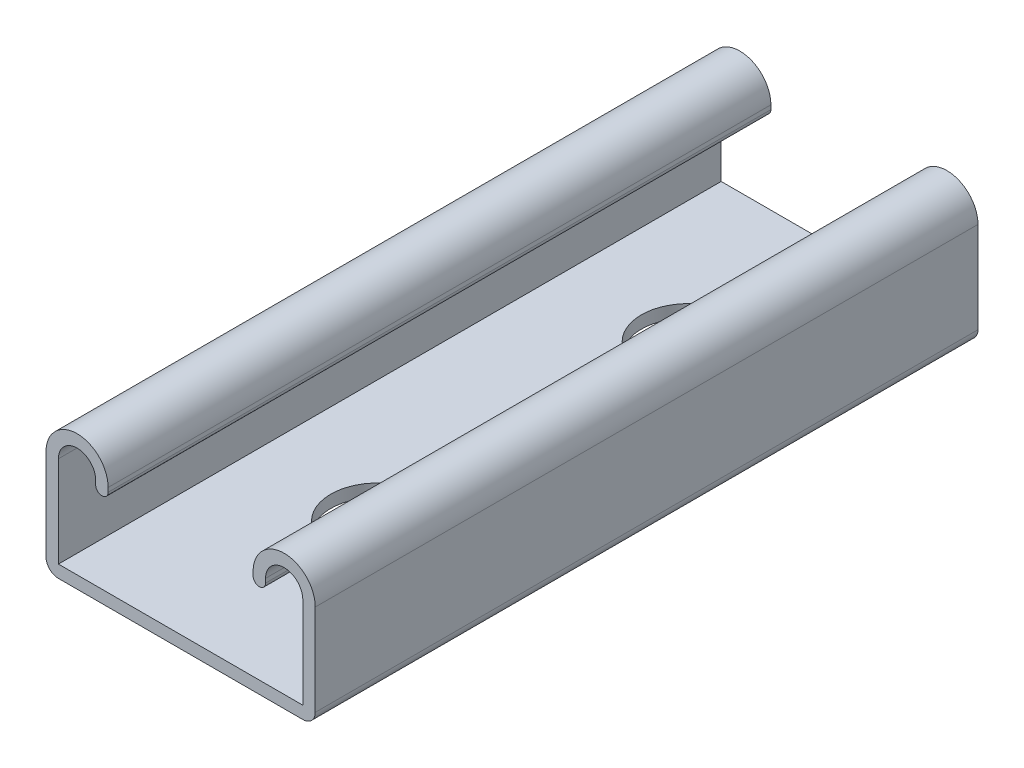
ISO-10303-21;
HEADER;
FILE_DESCRIPTION(('STEP AP214'),'2;1');
FILE_NAME('part.step','',(''),(''),'','','');
FILE_SCHEMA(('AUTOMOTIVE_DESIGN { 1 0 10303 214 1 1 1 1 }'));
ENDSEC;
DATA;
#1=APPLICATION_CONTEXT('core data for automotive mechanical design processes');
#2=APPLICATION_PROTOCOL_DEFINITION('international standard','automotive_design',2000,#1);
#3=PRODUCT_CONTEXT('',#1,'mechanical');
#4=PRODUCT('Part','Part','',(#3));
#5=PRODUCT_RELATED_PRODUCT_CATEGORY('part','',(#4));
#6=PRODUCT_DEFINITION_FORMATION('','',#4);
#7=PRODUCT_DEFINITION_CONTEXT('part definition',#1,'design');
#8=PRODUCT_DEFINITION('design','',#6,#7);
#9=PRODUCT_DEFINITION_SHAPE('','',#8);
#10=(LENGTH_UNIT() NAMED_UNIT(*) SI_UNIT(.MILLI.,.METRE.));
#11=(NAMED_UNIT(*) PLANE_ANGLE_UNIT() SI_UNIT($,.RADIAN.));
#12=(NAMED_UNIT(*) SI_UNIT($,.STERADIAN.) SOLID_ANGLE_UNIT());
#13=UNCERTAINTY_MEASURE_WITH_UNIT(LENGTH_MEASURE(1.E-05),#10,'distance_accuracy_value','');
#14=(GEOMETRIC_REPRESENTATION_CONTEXT(3) GLOBAL_UNCERTAINTY_ASSIGNED_CONTEXT((#13)) GLOBAL_UNIT_ASSIGNED_CONTEXT((#10,
#11,#12)) REPRESENTATION_CONTEXT('',''));
#15=CARTESIAN_POINT('',(0.,0.,0.));
#16=DIRECTION('',(0.,0.,1.));
#17=DIRECTION('',(1.,0.,0.));
#18=AXIS2_PLACEMENT_3D('',#15,#16,#17);
#19=CARTESIAN_POINT('',(-15.875,7.4295,101.6));
#20=DIRECTION('',(0.,0.,-1.));
#21=DIRECTION('',(-1.,0.,0.));
#22=AXIS2_PLACEMENT_3D('',#19,#20,#21);
#23=CYLINDRICAL_SURFACE('',#22,4.7625);
#24=CARTESIAN_POINT('',(-15.875,7.4295,0.));
#25=DIRECTION('',(0.,0.,1.));
#26=DIRECTION('',(-1.,0.,0.));
#27=AXIS2_PLACEMENT_3D('',#24,#25,#26);
#28=CIRCLE('',#27,4.7625);
#29=CARTESIAN_POINT('',(-11.1125,7.4295,0.));
#30=VERTEX_POINT('',#29);
#31=CARTESIAN_POINT('',(-20.6375,7.4295,0.));
#32=VERTEX_POINT('',#31);
#33=EDGE_CURVE('E189',#30,#32,#28,.T.);
#34=ORIENTED_EDGE('',*,*,#33,.T.);
#35=DIRECTION('',(0.,0.,-1.));
#36=VECTOR('',#35,1.);
#37=CARTESIAN_POINT('',(-20.6375,7.4295,101.6));
#38=LINE('',#37,#36);
#39=CARTESIAN_POINT('',(-20.6375,7.4295,101.6));
#40=VERTEX_POINT('',#39);
#41=EDGE_CURVE('E11',#40,#32,#38,.T.);
#42=ORIENTED_EDGE('',*,*,#41,.F.);
#43=CARTESIAN_POINT('',(-15.875,7.4295,101.6));
#44=DIRECTION('',(0.,0.,1.));
#45=DIRECTION('',(-1.,0.,0.));
#46=AXIS2_PLACEMENT_3D('',#43,#44,#45);
#47=CIRCLE('',#46,4.7625);
#48=CARTESIAN_POINT('',(-11.1125,7.4295,101.6));
#49=VERTEX_POINT('',#48);
#50=EDGE_CURVE('E223',#49,#40,#47,.T.);
#51=ORIENTED_EDGE('',*,*,#50,.F.);
#52=DIRECTION('',(0.,0.,-1.));
#53=VECTOR('',#52,1.);
#54=CARTESIAN_POINT('',(-11.1125,7.4295,101.6));
#55=LINE('',#54,#53);
#56=EDGE_CURVE('E185',#49,#30,#55,.T.);
#57=ORIENTED_EDGE('',*,*,#56,.T.);
#58=EDGE_LOOP('',(#34,#42,#51,#57));
#59=FACE_BOUND('',#58,.T.);
#60=ADVANCED_FACE('F32',(#59),#23,.T.);
#61=CARTESIAN_POINT('',(-20.6375,7.4295,101.6));
#62=DIRECTION('',(1.,0.,0.));
#63=DIRECTION('',(0.,0.,-1.));
#64=AXIS2_PLACEMENT_3D('',#61,#62,#63);
#65=PLANE('',#64);
#66=DIRECTION('',(0.,-1.,0.));
#67=VECTOR('',#66,1.);
#68=CARTESIAN_POINT('',(-20.6375,7.4295,0.));
#69=LINE('',#68,#67);
#70=CARTESIAN_POINT('',(-20.6375,-6.5532,0.));
#71=VERTEX_POINT('',#70);
#72=EDGE_CURVE('E192',#32,#71,#69,.T.);
#73=ORIENTED_EDGE('',*,*,#72,.T.);
#74=DIRECTION('',(0.,0.,-1.));
#75=VECTOR('',#74,1.);
#76=CARTESIAN_POINT('',(-20.6375,-6.5532,101.6));
#77=LINE('',#76,#75);
#78=CARTESIAN_POINT('',(-20.6375,-6.5532,101.6));
#79=VERTEX_POINT('',#78);
#80=EDGE_CURVE('E41',#79,#71,#77,.T.);
#81=ORIENTED_EDGE('',*,*,#80,.F.);
#82=DIRECTION('',(0.,-1.,0.));
#83=VECTOR('',#82,1.);
#84=CARTESIAN_POINT('',(-20.6375,7.4295,101.6));
#85=LINE('',#84,#83);
#86=EDGE_CURVE('E122',#40,#79,#85,.T.);
#87=ORIENTED_EDGE('',*,*,#86,.F.);
#88=ORIENTED_EDGE('',*,*,#41,.T.);
#89=EDGE_LOOP('',(#73,#81,#87,#88));
#90=FACE_BOUND('',#89,.T.);
#91=ADVANCED_FACE('F332',(#90),#65,.F.);
#92=CARTESIAN_POINT('',(-18.7325,-6.5532,101.6));
#93=DIRECTION('',(0.,0.,-1.));
#94=DIRECTION('',(-1.,0.,0.));
#95=AXIS2_PLACEMENT_3D('',#92,#93,#94);
#96=CYLINDRICAL_SURFACE('',#95,1.905);
#97=CARTESIAN_POINT('',(-18.7325,-6.5532,0.));
#98=DIRECTION('',(0.,0.,1.));
#99=DIRECTION('',(-1.,0.,0.));
#100=AXIS2_PLACEMENT_3D('',#97,#98,#99);
#101=CIRCLE('',#100,1.905);
#102=CARTESIAN_POINT('',(-18.7325,-8.4582,0.));
#103=VERTEX_POINT('',#102);
#104=EDGE_CURVE('E194',#71,#103,#101,.T.);
#105=ORIENTED_EDGE('',*,*,#104,.T.);
#106=DIRECTION('',(0.,0.,-1.));
#107=VECTOR('',#106,1.);
#108=CARTESIAN_POINT('',(-18.7325,-8.4582,101.6));
#109=LINE('',#108,#107);
#110=CARTESIAN_POINT('',(-18.7325,-8.4582,101.6));
#111=VERTEX_POINT('',#110);
#112=EDGE_CURVE('E260',#111,#103,#109,.T.);
#113=ORIENTED_EDGE('',*,*,#112,.F.);
#114=CARTESIAN_POINT('',(-18.7325,-6.5532,101.6));
#115=DIRECTION('',(0.,0.,1.));
#116=DIRECTION('',(-1.,0.,0.));
#117=AXIS2_PLACEMENT_3D('',#114,#115,#116);
#118=CIRCLE('',#117,1.905);
#119=EDGE_CURVE('E269',#79,#111,#118,.T.);
#120=ORIENTED_EDGE('',*,*,#119,.F.);
#121=ORIENTED_EDGE('',*,*,#80,.T.);
#122=EDGE_LOOP('',(#105,#113,#120,#121));
#123=FACE_BOUND('',#122,.T.);
#124=ADVANCED_FACE('F267',(#123),#96,.T.);
#125=CARTESIAN_POINT('',(-18.7325,-8.4582,101.6));
#126=DIRECTION('',(0.,1.,0.));
#127=DIRECTION('',(0.,0.,1.));
#128=AXIS2_PLACEMENT_3D('',#125,#126,#127);
#129=PLANE('',#128);
#130=CARTESIAN_POINT('',(0.,-8.4582,71.4375));
#131=DIRECTION('',(0.,-1.,0.));
#132=DIRECTION('',(0.,0.,-1.));
#133=AXIS2_PLACEMENT_3D('',#130,#131,#132);
#134=CIRCLE('',#133,7.14375);
#135=CARTESIAN_POINT('',(0.,-8.4582,64.29375));
#136=VERTEX_POINT('',#135);
#137=EDGE_CURVE('E451',#136,#136,#134,.T.);
#138=ORIENTED_EDGE('',*,*,#137,.F.);
#139=EDGE_LOOP('',(#138));
#140=FACE_BOUND('',#139,.T.);
#141=CARTESIAN_POINT('',(0.,-8.4582,23.8125));
#142=DIRECTION('',(0.,-1.,0.));
#143=DIRECTION('',(0.,0.,-1.));
#144=AXIS2_PLACEMENT_3D('',#141,#142,#143);
#145=CIRCLE('',#144,7.14375);
#146=CARTESIAN_POINT('',(0.,-8.4582,16.66875));
#147=VERTEX_POINT('',#146);
#148=EDGE_CURVE('E455',#147,#147,#145,.T.);
#149=ORIENTED_EDGE('',*,*,#148,.F.);
#150=EDGE_LOOP('',(#149));
#151=FACE_BOUND('',#150,.T.);
#152=DIRECTION('',(1.,0.,0.));
#153=VECTOR('',#152,1.);
#154=CARTESIAN_POINT('',(-18.7325,-8.4582,0.));
#155=LINE('',#154,#153);
#156=CARTESIAN_POINT('',(18.7325,-8.4582,0.));
#157=VERTEX_POINT('',#156);
#158=EDGE_CURVE('E196',#103,#157,#155,.T.);
#159=ORIENTED_EDGE('',*,*,#158,.T.);
#160=DIRECTION('',(0.,0.,-1.));
#161=VECTOR('',#160,1.);
#162=CARTESIAN_POINT('',(18.7325,-8.4582,101.6));
#163=LINE('',#162,#161);
#164=CARTESIAN_POINT('',(18.7325,-8.4582,101.6));
#165=VERTEX_POINT('',#164);
#166=EDGE_CURVE('E257',#165,#157,#163,.T.);
#167=ORIENTED_EDGE('',*,*,#166,.F.);
#168=DIRECTION('',(1.,0.,0.));
#169=VECTOR('',#168,1.);
#170=CARTESIAN_POINT('',(-18.7325,-8.4582,101.6));
#171=LINE('',#170,#169);
#172=EDGE_CURVE('E287',#111,#165,#171,.T.);
#173=ORIENTED_EDGE('',*,*,#172,.F.);
#174=ORIENTED_EDGE('',*,*,#112,.T.);
#175=EDGE_LOOP('',(#159,#167,#173,#174));
#176=FACE_BOUND('',#175,.T.);
#177=ADVANCED_FACE('F278',(#140,#151,#176),#129,.F.);
#178=CARTESIAN_POINT('',(18.7325,-6.5532,101.6));
#179=DIRECTION('',(0.,0.,-1.));
#180=DIRECTION('',(-1.,0.,0.));
#181=AXIS2_PLACEMENT_3D('',#178,#179,#180);
#182=CYLINDRICAL_SURFACE('',#181,1.905);
#183=CARTESIAN_POINT('',(18.7325,-6.5532,0.));
#184=DIRECTION('',(0.,0.,1.));
#185=DIRECTION('',(1.,0.,0.));
#186=AXIS2_PLACEMENT_3D('',#183,#184,#185);
#187=CIRCLE('',#186,1.905);
#188=CARTESIAN_POINT('',(20.6375,-6.5532,0.));
#189=VERTEX_POINT('',#188);
#190=EDGE_CURVE('E198',#157,#189,#187,.T.);
#191=ORIENTED_EDGE('',*,*,#190,.T.);
#192=DIRECTION('',(0.,0.,-1.));
#193=VECTOR('',#192,1.);
#194=CARTESIAN_POINT('',(20.6375,-6.5532,101.6));
#195=LINE('',#194,#193);
#196=CARTESIAN_POINT('',(20.6375,-6.5532,101.6));
#197=VERTEX_POINT('',#196);
#198=EDGE_CURVE('E254',#197,#189,#195,.T.);
#199=ORIENTED_EDGE('',*,*,#198,.F.);
#200=CARTESIAN_POINT('',(18.7325,-6.5532,101.6));
#201=DIRECTION('',(0.,0.,1.));
#202=DIRECTION('',(1.,0.,0.));
#203=AXIS2_PLACEMENT_3D('',#200,#201,#202);
#204=CIRCLE('',#203,1.905);
#205=EDGE_CURVE('E284',#165,#197,#204,.T.);
#206=ORIENTED_EDGE('',*,*,#205,.F.);
#207=ORIENTED_EDGE('',*,*,#166,.T.);
#208=EDGE_LOOP('',(#191,#199,#206,#207));
#209=FACE_BOUND('',#208,.T.);
#210=ADVANCED_FACE('F282',(#209),#182,.T.);
#211=CARTESIAN_POINT('',(20.6375,-6.5532,101.6));
#212=DIRECTION('',(-1.,0.,0.));
#213=DIRECTION('',(0.,-1.,0.));
#214=AXIS2_PLACEMENT_3D('',#211,#212,#213);
#215=PLANE('',#214);
#216=DIRECTION('',(0.,1.,0.));
#217=VECTOR('',#216,1.);
#218=CARTESIAN_POINT('',(20.6375,-6.5532,0.));
#219=LINE('',#218,#217);
#220=CARTESIAN_POINT('',(20.6375,7.4295,0.));
#221=VERTEX_POINT('',#220);
#222=EDGE_CURVE('E200',#189,#221,#219,.T.);
#223=ORIENTED_EDGE('',*,*,#222,.T.);
#224=DIRECTION('',(0.,0.,-1.));
#225=VECTOR('',#224,1.);
#226=CARTESIAN_POINT('',(20.6375,7.4295,101.6));
#227=LINE('',#226,#225);
#228=CARTESIAN_POINT('',(20.6375,7.4295,101.6));
#229=VERTEX_POINT('',#228);
#230=EDGE_CURVE('E251',#229,#221,#227,.T.);
#231=ORIENTED_EDGE('',*,*,#230,.F.);
#232=DIRECTION('',(0.,1.,0.));
#233=VECTOR('',#232,1.);
#234=CARTESIAN_POINT('',(20.6375,-6.5532,101.6));
#235=LINE('',#234,#233);
#236=EDGE_CURVE('E286',#197,#229,#235,.T.);
#237=ORIENTED_EDGE('',*,*,#236,.F.);
#238=ORIENTED_EDGE('',*,*,#198,.T.);
#239=EDGE_LOOP('',(#223,#231,#237,#238));
#240=FACE_BOUND('',#239,.T.);
#241=ADVANCED_FACE('F346',(#240),#215,.F.);
#242=CARTESIAN_POINT('',(15.875,7.4295,101.6));
#243=DIRECTION('',(0.,0.,-1.));
#244=DIRECTION('',(-1.,0.,0.));
#245=AXIS2_PLACEMENT_3D('',#242,#243,#244);
#246=CYLINDRICAL_SURFACE('',#245,4.7625);
#247=CARTESIAN_POINT('',(15.875,7.4295,0.));
#248=DIRECTION('',(0.,0.,1.));
#249=DIRECTION('',(1.,0.,0.));
#250=AXIS2_PLACEMENT_3D('',#247,#248,#249);
#251=CIRCLE('',#250,4.7625);
#252=CARTESIAN_POINT('',(11.1125,7.4295,0.));
#253=VERTEX_POINT('',#252);
#254=EDGE_CURVE('E202',#221,#253,#251,.T.);
#255=ORIENTED_EDGE('',*,*,#254,.T.);
#256=DIRECTION('',(0.,0.,-1.));
#257=VECTOR('',#256,1.);
#258=CARTESIAN_POINT('',(11.1125,7.4295,101.6));
#259=LINE('',#258,#257);
#260=CARTESIAN_POINT('',(11.1125,7.4295,101.6));
#261=VERTEX_POINT('',#260);
#262=EDGE_CURVE('E248',#261,#253,#259,.T.);
#263=ORIENTED_EDGE('',*,*,#262,.F.);
#264=CARTESIAN_POINT('',(15.875,7.4295,101.6));
#265=DIRECTION('',(0.,0.,1.));
#266=DIRECTION('',(1.,0.,0.));
#267=AXIS2_PLACEMENT_3D('',#264,#265,#266);
#268=CIRCLE('',#267,4.7625);
#269=EDGE_CURVE('E289',#229,#261,#268,.T.);
#270=ORIENTED_EDGE('',*,*,#269,.F.);
#271=ORIENTED_EDGE('',*,*,#230,.T.);
#272=EDGE_LOOP('',(#255,#263,#270,#271));
#273=FACE_BOUND('',#272,.T.);
#274=ADVANCED_FACE('F349',(#273),#246,.T.);
#275=CARTESIAN_POINT('',(11.1125,7.4295,101.6));
#276=DIRECTION('',(1.,0.,0.));
#277=DIRECTION('',(0.,1.,0.));
#278=AXIS2_PLACEMENT_3D('',#275,#276,#277);
#279=PLANE('',#278);
#280=DIRECTION('',(0.,-1.,0.));
#281=VECTOR('',#280,1.);
#282=CARTESIAN_POINT('',(11.1125,7.4295,0.));
#283=LINE('',#282,#281);
#284=CARTESIAN_POINT('',(11.1125,6.7945,0.));
#285=VERTEX_POINT('',#284);
#286=EDGE_CURVE('E204',#253,#285,#283,.T.);
#287=ORIENTED_EDGE('',*,*,#286,.T.);
#288=DIRECTION('',(0.,0.,-1.));
#289=VECTOR('',#288,1.);
#290=CARTESIAN_POINT('',(11.1125,6.7945,101.6));
#291=LINE('',#290,#289);
#292=CARTESIAN_POINT('',(11.1125,6.7945,101.6));
#293=VERTEX_POINT('',#292);
#294=EDGE_CURVE('E245',#293,#285,#291,.T.);
#295=ORIENTED_EDGE('',*,*,#294,.F.);
#296=DIRECTION('',(0.,-1.,0.));
#297=VECTOR('',#296,1.);
#298=CARTESIAN_POINT('',(11.1125,7.4295,101.6));
#299=LINE('',#298,#297);
#300=EDGE_CURVE('E295',#261,#293,#299,.T.);
#301=ORIENTED_EDGE('',*,*,#300,.F.);
#302=ORIENTED_EDGE('',*,*,#262,.T.);
#303=EDGE_LOOP('',(#287,#295,#301,#302));
#304=FACE_BOUND('',#303,.T.);
#305=ADVANCED_FACE('F353',(#304),#279,.F.);
#306=CARTESIAN_POINT('',(12.065,6.7945,101.6));
#307=DIRECTION('',(0.,0.,-1.));
#308=DIRECTION('',(-1.,0.,0.));
#309=AXIS2_PLACEMENT_3D('',#306,#307,#308);
#310=CYLINDRICAL_SURFACE('',#309,0.952500000000002);
#311=CARTESIAN_POINT('',(12.065,6.7945,0.));
#312=DIRECTION('',(0.,0.,1.));
#313=DIRECTION('',(1.,0.,0.));
#314=AXIS2_PLACEMENT_3D('',#311,#312,#313);
#315=CIRCLE('',#314,0.952500000000002);
#316=CARTESIAN_POINT('',(13.0175,6.7945,0.));
#317=VERTEX_POINT('',#316);
#318=EDGE_CURVE('E206',#285,#317,#315,.T.);
#319=ORIENTED_EDGE('',*,*,#318,.T.);
#320=DIRECTION('',(0.,0.,-1.));
#321=VECTOR('',#320,1.);
#322=CARTESIAN_POINT('',(13.0175,6.7945,101.6));
#323=LINE('',#322,#321);
#324=CARTESIAN_POINT('',(13.0175,6.7945,101.6));
#325=VERTEX_POINT('',#324);
#326=EDGE_CURVE('E242',#325,#317,#323,.T.);
#327=ORIENTED_EDGE('',*,*,#326,.F.);
#328=CARTESIAN_POINT('',(12.065,6.7945,101.6));
#329=DIRECTION('',(0.,0.,1.));
#330=DIRECTION('',(1.,0.,0.));
#331=AXIS2_PLACEMENT_3D('',#328,#329,#330);
#332=CIRCLE('',#331,0.952500000000002);
#333=EDGE_CURVE('E297',#293,#325,#332,.T.);
#334=ORIENTED_EDGE('',*,*,#333,.F.);
#335=ORIENTED_EDGE('',*,*,#294,.T.);
#336=EDGE_LOOP('',(#319,#327,#334,#335));
#337=FACE_BOUND('',#336,.T.);
#338=ADVANCED_FACE('F357',(#337),#310,.T.);
#339=CARTESIAN_POINT('',(13.0175,7.4295,101.6));
#340=DIRECTION('',(-1.,0.,0.));
#341=DIRECTION('',(0.,-1.,0.));
#342=AXIS2_PLACEMENT_3D('',#339,#340,#341);
#343=PLANE('',#342);
#344=DIRECTION('',(0.,1.,0.));
#345=VECTOR('',#344,1.);
#346=CARTESIAN_POINT('',(13.0175,7.4295,0.));
#347=LINE('',#346,#345);
#348=CARTESIAN_POINT('',(13.0175,7.4295,0.));
#349=VERTEX_POINT('',#348);
#350=EDGE_CURVE('E208',#317,#349,#347,.T.);
#351=ORIENTED_EDGE('',*,*,#350,.T.);
#352=DIRECTION('',(0.,0.,-1.));
#353=VECTOR('',#352,1.);
#354=CARTESIAN_POINT('',(13.0175,7.4295,101.6));
#355=LINE('',#354,#353);
#356=CARTESIAN_POINT('',(13.0175,7.4295,101.6));
#357=VERTEX_POINT('',#356);
#358=EDGE_CURVE('E239',#357,#349,#355,.T.);
#359=ORIENTED_EDGE('',*,*,#358,.F.);
#360=DIRECTION('',(0.,1.,0.));
#361=VECTOR('',#360,1.);
#362=CARTESIAN_POINT('',(13.0175,7.4295,101.6));
#363=LINE('',#362,#361);
#364=EDGE_CURVE('E299',#325,#357,#363,.T.);
#365=ORIENTED_EDGE('',*,*,#364,.F.);
#366=ORIENTED_EDGE('',*,*,#326,.T.);
#367=EDGE_LOOP('',(#351,#359,#365,#366));
#368=FACE_BOUND('',#367,.T.);
#369=ADVANCED_FACE('F361',(#368),#343,.F.);
#370=CARTESIAN_POINT('',(15.875,7.4295,101.6));
#371=DIRECTION('',(0.,0.,-1.));
#372=DIRECTION('',(-1.,0.,0.));
#373=AXIS2_PLACEMENT_3D('',#370,#371,#372);
#374=CYLINDRICAL_SURFACE('',#373,2.8575);
#375=CARTESIAN_POINT('',(15.875,7.4295,0.));
#376=DIRECTION('',(0.,0.,-1.));
#377=DIRECTION('',(1.,0.,0.));
#378=AXIS2_PLACEMENT_3D('',#375,#376,#377);
#379=CIRCLE('',#378,2.8575);
#380=CARTESIAN_POINT('',(18.7325,7.4295,0.));
#381=VERTEX_POINT('',#380);
#382=EDGE_CURVE('E210',#349,#381,#379,.T.);
#383=ORIENTED_EDGE('',*,*,#382,.T.);
#384=DIRECTION('',(0.,0.,-1.));
#385=VECTOR('',#384,1.);
#386=CARTESIAN_POINT('',(18.7325,7.4295,101.6));
#387=LINE('',#386,#385);
#388=CARTESIAN_POINT('',(18.7325,7.4295,101.6));
#389=VERTEX_POINT('',#388);
#390=EDGE_CURVE('E236',#389,#381,#387,.T.);
#391=ORIENTED_EDGE('',*,*,#390,.F.);
#392=CARTESIAN_POINT('',(15.875,7.4295,101.6));
#393=DIRECTION('',(0.,0.,-1.));
#394=DIRECTION('',(1.,0.,0.));
#395=AXIS2_PLACEMENT_3D('',#392,#393,#394);
#396=CIRCLE('',#395,2.8575);
#397=EDGE_CURVE('E301',#357,#389,#396,.T.);
#398=ORIENTED_EDGE('',*,*,#397,.F.);
#399=ORIENTED_EDGE('',*,*,#358,.T.);
#400=EDGE_LOOP('',(#383,#391,#398,#399));
#401=FACE_BOUND('',#400,.T.);
#402=ADVANCED_FACE('F365',(#401),#374,.F.);
#403=CARTESIAN_POINT('',(18.7325,-6.5532,101.6));
#404=DIRECTION('',(1.,0.,0.));
#405=DIRECTION('',(0.,1.,0.));
#406=AXIS2_PLACEMENT_3D('',#403,#404,#405);
#407=PLANE('',#406);
#408=DIRECTION('',(0.,-1.,0.));
#409=VECTOR('',#408,1.);
#410=CARTESIAN_POINT('',(18.7325,-6.5532,0.));
#411=LINE('',#410,#409);
#412=CARTESIAN_POINT('',(18.7325,-6.5532,0.));
#413=VERTEX_POINT('',#412);
#414=EDGE_CURVE('E212',#381,#413,#411,.T.);
#415=ORIENTED_EDGE('',*,*,#414,.T.);
#416=DIRECTION('',(0.,0.,-1.));
#417=VECTOR('',#416,1.);
#418=CARTESIAN_POINT('',(18.7325,-6.5532,101.6));
#419=LINE('',#418,#417);
#420=CARTESIAN_POINT('',(18.7325,-6.5532,101.6));
#421=VERTEX_POINT('',#420);
#422=EDGE_CURVE('E233',#421,#413,#419,.T.);
#423=ORIENTED_EDGE('',*,*,#422,.F.);
#424=DIRECTION('',(0.,-1.,0.));
#425=VECTOR('',#424,1.);
#426=CARTESIAN_POINT('',(18.7325,-6.5532,101.6));
#427=LINE('',#426,#425);
#428=EDGE_CURVE('E303',#389,#421,#427,.T.);
#429=ORIENTED_EDGE('',*,*,#428,.F.);
#430=ORIENTED_EDGE('',*,*,#390,.T.);
#431=EDGE_LOOP('',(#415,#423,#429,#430));
#432=FACE_BOUND('',#431,.T.);
#433=ADVANCED_FACE('F369',(#432),#407,.F.);
#434=CARTESIAN_POINT('',(-18.7325,-6.5532,101.6));
#435=DIRECTION('',(0.,-1.,0.));
#436=DIRECTION('',(0.,0.,-1.));
#437=AXIS2_PLACEMENT_3D('',#434,#435,#436);
#438=PLANE('',#437);
#439=CARTESIAN_POINT('',(0.,-6.5532,71.4375));
#440=DIRECTION('',(0.,-1.,0.));
#441=DIRECTION('',(0.,0.,-1.));
#442=AXIS2_PLACEMENT_3D('',#439,#440,#441);
#443=CIRCLE('',#442,7.14375);
#444=CARTESIAN_POINT('',(0.,-6.5532,64.29375));
#445=VERTEX_POINT('',#444);
#446=EDGE_CURVE('E454',#445,#445,#443,.T.);
#447=ORIENTED_EDGE('',*,*,#446,.T.);
#448=EDGE_LOOP('',(#447));
#449=FACE_BOUND('',#448,.T.);
#450=CARTESIAN_POINT('',(0.,-6.5532,23.8125));
#451=DIRECTION('',(0.,-1.,0.));
#452=DIRECTION('',(0.,0.,-1.));
#453=AXIS2_PLACEMENT_3D('',#450,#451,#452);
#454=CIRCLE('',#453,7.14375);
#455=CARTESIAN_POINT('',(0.,-6.5532,16.66875));
#456=VERTEX_POINT('',#455);
#457=EDGE_CURVE('E35',#456,#456,#454,.T.);
#458=ORIENTED_EDGE('',*,*,#457,.T.);
#459=EDGE_LOOP('',(#458));
#460=FACE_BOUND('',#459,.T.);
#461=DIRECTION('',(-1.,0.,0.));
#462=VECTOR('',#461,1.);
#463=CARTESIAN_POINT('',(-18.7325,-6.5532,0.));
#464=LINE('',#463,#462);
#465=CARTESIAN_POINT('',(-18.7325,-6.5532,0.));
#466=VERTEX_POINT('',#465);
#467=EDGE_CURVE('E214',#413,#466,#464,.T.);
#468=ORIENTED_EDGE('',*,*,#467,.T.);
#469=DIRECTION('',(0.,0.,-1.));
#470=VECTOR('',#469,1.);
#471=CARTESIAN_POINT('',(-18.7325,-6.5532,101.6));
#472=LINE('',#471,#470);
#473=CARTESIAN_POINT('',(-18.7325,-6.5532,101.6));
#474=VERTEX_POINT('',#473);
#475=EDGE_CURVE('E230',#474,#466,#472,.T.);
#476=ORIENTED_EDGE('',*,*,#475,.F.);
#477=DIRECTION('',(-1.,0.,0.));
#478=VECTOR('',#477,1.);
#479=CARTESIAN_POINT('',(-18.7325,-6.5532,101.6));
#480=LINE('',#479,#478);
#481=EDGE_CURVE('E305',#421,#474,#480,.T.);
#482=ORIENTED_EDGE('',*,*,#481,.F.);
#483=ORIENTED_EDGE('',*,*,#422,.T.);
#484=EDGE_LOOP('',(#468,#476,#482,#483));
#485=FACE_BOUND('',#484,.T.);
#486=ADVANCED_FACE('F373',(#449,#460,#485),#438,.F.);
#487=CARTESIAN_POINT('',(-18.7325,7.4295,101.6));
#488=DIRECTION('',(-1.,0.,0.));
#489=DIRECTION('',(0.,0.,1.));
#490=AXIS2_PLACEMENT_3D('',#487,#488,#489);
#491=PLANE('',#490);
#492=DIRECTION('',(0.,1.,0.));
#493=VECTOR('',#492,1.);
#494=CARTESIAN_POINT('',(-18.7325,7.4295,0.));
#495=LINE('',#494,#493);
#496=CARTESIAN_POINT('',(-18.7325,7.4295,0.));
#497=VERTEX_POINT('',#496);
#498=EDGE_CURVE('E216',#466,#497,#495,.T.);
#499=ORIENTED_EDGE('',*,*,#498,.T.);
#500=DIRECTION('',(0.,0.,-1.));
#501=VECTOR('',#500,1.);
#502=CARTESIAN_POINT('',(-18.7325,7.4295,101.6));
#503=LINE('',#502,#501);
#504=CARTESIAN_POINT('',(-18.7325,7.4295,101.6));
#505=VERTEX_POINT('',#504);
#506=EDGE_CURVE('E227',#505,#497,#503,.T.);
#507=ORIENTED_EDGE('',*,*,#506,.F.);
#508=DIRECTION('',(0.,1.,0.));
#509=VECTOR('',#508,1.);
#510=CARTESIAN_POINT('',(-18.7325,7.4295,101.6));
#511=LINE('',#510,#509);
#512=EDGE_CURVE('E307',#474,#505,#511,.T.);
#513=ORIENTED_EDGE('',*,*,#512,.F.);
#514=ORIENTED_EDGE('',*,*,#475,.T.);
#515=EDGE_LOOP('',(#499,#507,#513,#514));
#516=FACE_BOUND('',#515,.T.);
#517=ADVANCED_FACE('F313',(#516),#491,.F.);
#518=CARTESIAN_POINT('',(-15.875,7.4295,101.6));
#519=DIRECTION('',(0.,0.,-1.));
#520=DIRECTION('',(-1.,0.,0.));
#521=AXIS2_PLACEMENT_3D('',#518,#519,#520);
#522=CYLINDRICAL_SURFACE('',#521,2.8575);
#523=CARTESIAN_POINT('',(-15.875,7.4295,0.));
#524=DIRECTION('',(0.,0.,-1.));
#525=DIRECTION('',(-1.,0.,0.));
#526=AXIS2_PLACEMENT_3D('',#523,#524,#525);
#527=CIRCLE('',#526,2.8575);
#528=CARTESIAN_POINT('',(-13.0175,7.4295,0.));
#529=VERTEX_POINT('',#528);
#530=EDGE_CURVE('E218',#497,#529,#527,.T.);
#531=ORIENTED_EDGE('',*,*,#530,.T.);
#532=DIRECTION('',(0.,0.,-1.));
#533=VECTOR('',#532,1.);
#534=CARTESIAN_POINT('',(-13.0175,7.4295,101.6));
#535=LINE('',#534,#533);
#536=CARTESIAN_POINT('',(-13.0175,7.4295,101.6));
#537=VERTEX_POINT('',#536);
#538=EDGE_CURVE('E180',#537,#529,#535,.T.);
#539=ORIENTED_EDGE('',*,*,#538,.F.);
#540=CARTESIAN_POINT('',(-15.875,7.4295,101.6));
#541=DIRECTION('',(0.,0.,-1.));
#542=DIRECTION('',(-1.,0.,0.));
#543=AXIS2_PLACEMENT_3D('',#540,#541,#542);
#544=CIRCLE('',#543,2.8575);
#545=EDGE_CURVE('E171',#505,#537,#544,.T.);
#546=ORIENTED_EDGE('',*,*,#545,.F.);
#547=ORIENTED_EDGE('',*,*,#506,.T.);
#548=EDGE_LOOP('',(#531,#539,#546,#547));
#549=FACE_BOUND('',#548,.T.);
#550=ADVANCED_FACE('F317',(#549),#522,.F.);
#551=CARTESIAN_POINT('',(-13.0175,7.4295,101.6));
#552=DIRECTION('',(1.,0.,0.));
#553=DIRECTION('',(0.,1.,0.));
#554=AXIS2_PLACEMENT_3D('',#551,#552,#553);
#555=PLANE('',#554);
#556=DIRECTION('',(0.,-1.,0.));
#557=VECTOR('',#556,1.);
#558=CARTESIAN_POINT('',(-13.0175,7.4295,0.));
#559=LINE('',#558,#557);
#560=CARTESIAN_POINT('',(-13.0175,6.7945,0.));
#561=VERTEX_POINT('',#560);
#562=EDGE_CURVE('E179',#529,#561,#559,.T.);
#563=ORIENTED_EDGE('',*,*,#562,.T.);
#564=DIRECTION('',(0.,0.,-1.));
#565=VECTOR('',#564,1.);
#566=CARTESIAN_POINT('',(-13.0175,6.7945,101.6));
#567=LINE('',#566,#565);
#568=CARTESIAN_POINT('',(-13.0175,6.7945,101.6));
#569=VERTEX_POINT('',#568);
#570=EDGE_CURVE('E176',#569,#561,#567,.T.);
#571=ORIENTED_EDGE('',*,*,#570,.F.);
#572=DIRECTION('',(0.,-1.,0.));
#573=VECTOR('',#572,1.);
#574=CARTESIAN_POINT('',(-13.0175,7.4295,101.6));
#575=LINE('',#574,#573);
#576=EDGE_CURVE('E165',#537,#569,#575,.T.);
#577=ORIENTED_EDGE('',*,*,#576,.F.);
#578=ORIENTED_EDGE('',*,*,#538,.T.);
#579=EDGE_LOOP('',(#563,#571,#577,#578));
#580=FACE_BOUND('',#579,.T.);
#581=ADVANCED_FACE('F177',(#580),#555,.F.);
#582=CARTESIAN_POINT('',(-12.065,6.7945,101.6));
#583=DIRECTION('',(0.,0.,-1.));
#584=DIRECTION('',(-1.,0.,0.));
#585=AXIS2_PLACEMENT_3D('',#582,#583,#584);
#586=CYLINDRICAL_SURFACE('',#585,0.952499999999999);
#587=CARTESIAN_POINT('',(-12.065,6.7945,0.));
#588=DIRECTION('',(0.,0.,1.));
#589=DIRECTION('',(-1.,0.,0.));
#590=AXIS2_PLACEMENT_3D('',#587,#588,#589);
#591=CIRCLE('',#590,0.952499999999999);
#592=CARTESIAN_POINT('',(-11.1125,6.7945,0.));
#593=VERTEX_POINT('',#592);
#594=EDGE_CURVE('E108',#561,#593,#591,.T.);
#595=ORIENTED_EDGE('',*,*,#594,.T.);
#596=DIRECTION('',(0.,0.,-1.));
#597=VECTOR('',#596,1.);
#598=CARTESIAN_POINT('',(-11.1125,6.7945,101.6));
#599=LINE('',#598,#597);
#600=CARTESIAN_POINT('',(-11.1125,6.7945,101.6));
#601=VERTEX_POINT('',#600);
#602=EDGE_CURVE('E181',#601,#593,#599,.T.);
#603=ORIENTED_EDGE('',*,*,#602,.F.);
#604=CARTESIAN_POINT('',(-12.065,6.7945,101.6));
#605=DIRECTION('',(0.,0.,1.));
#606=DIRECTION('',(-1.,0.,0.));
#607=AXIS2_PLACEMENT_3D('',#604,#605,#606);
#608=CIRCLE('',#607,0.952499999999999);
#609=EDGE_CURVE('E169',#569,#601,#608,.T.);
#610=ORIENTED_EDGE('',*,*,#609,.F.);
#611=ORIENTED_EDGE('',*,*,#570,.T.);
#612=EDGE_LOOP('',(#595,#603,#610,#611));
#613=FACE_BOUND('',#612,.T.);
#614=ADVANCED_FACE('F183',(#613),#586,.T.);
#615=CARTESIAN_POINT('',(-11.1125,7.4295,101.6));
#616=DIRECTION('',(-1.,0.,0.));
#617=DIRECTION('',(0.,-1.,0.));
#618=AXIS2_PLACEMENT_3D('',#615,#616,#617);
#619=PLANE('',#618);
#620=DIRECTION('',(0.,1.,0.));
#621=VECTOR('',#620,1.);
#622=CARTESIAN_POINT('',(-11.1125,7.4295,0.));
#623=LINE('',#622,#621);
#624=EDGE_CURVE('E114',#593,#30,#623,.T.);
#625=ORIENTED_EDGE('',*,*,#624,.T.);
#626=ORIENTED_EDGE('',*,*,#56,.F.);
#627=DIRECTION('',(0.,1.,0.));
#628=VECTOR('',#627,1.);
#629=CARTESIAN_POINT('',(-11.1125,7.4295,101.6));
#630=LINE('',#629,#628);
#631=EDGE_CURVE('E49',#601,#49,#630,.T.);
#632=ORIENTED_EDGE('',*,*,#631,.F.);
#633=ORIENTED_EDGE('',*,*,#602,.T.);
#634=EDGE_LOOP('',(#625,#626,#632,#633));
#635=FACE_BOUND('',#634,.T.);
#636=ADVANCED_FACE('F321',(#635),#619,.F.);
#637=CARTESIAN_POINT('',(-15.875,7.4295,101.6));
#638=DIRECTION('',(0.,0.,-1.));
#639=DIRECTION('',(-1.,0.,0.));
#640=AXIS2_PLACEMENT_3D('',#637,#638,#639);
#641=PLANE('',#640);
#642=ORIENTED_EDGE('',*,*,#50,.T.);
#643=ORIENTED_EDGE('',*,*,#86,.T.);
#644=ORIENTED_EDGE('',*,*,#119,.T.);
#645=ORIENTED_EDGE('',*,*,#172,.T.);
#646=ORIENTED_EDGE('',*,*,#205,.T.);
#647=ORIENTED_EDGE('',*,*,#236,.T.);
#648=ORIENTED_EDGE('',*,*,#269,.T.);
#649=ORIENTED_EDGE('',*,*,#300,.T.);
#650=ORIENTED_EDGE('',*,*,#333,.T.);
#651=ORIENTED_EDGE('',*,*,#364,.T.);
#652=ORIENTED_EDGE('',*,*,#397,.T.);
#653=ORIENTED_EDGE('',*,*,#428,.T.);
#654=ORIENTED_EDGE('',*,*,#481,.T.);
#655=ORIENTED_EDGE('',*,*,#512,.T.);
#656=ORIENTED_EDGE('',*,*,#545,.T.);
#657=ORIENTED_EDGE('',*,*,#576,.T.);
#658=ORIENTED_EDGE('',*,*,#609,.T.);
#659=ORIENTED_EDGE('',*,*,#631,.T.);
#660=EDGE_LOOP('',(#642,#643,#644,#645,#646,#647,#648,#649,#650,#651,#652,#653,#654,#655,#656,
#657,#658,#659));
#661=FACE_BOUND('',#660,.T.);
#662=ADVANCED_FACE('F167',(#661),#641,.F.);
#663=CARTESIAN_POINT('',(-15.875,7.4295,0.));
#664=DIRECTION('',(0.,0.,-1.));
#665=DIRECTION('',(-1.,0.,0.));
#666=AXIS2_PLACEMENT_3D('',#663,#664,#665);
#667=PLANE('',#666);
#668=ORIENTED_EDGE('',*,*,#33,.F.);
#669=ORIENTED_EDGE('',*,*,#624,.F.);
#670=ORIENTED_EDGE('',*,*,#594,.F.);
#671=ORIENTED_EDGE('',*,*,#562,.F.);
#672=ORIENTED_EDGE('',*,*,#530,.F.);
#673=ORIENTED_EDGE('',*,*,#498,.F.);
#674=ORIENTED_EDGE('',*,*,#467,.F.);
#675=ORIENTED_EDGE('',*,*,#414,.F.);
#676=ORIENTED_EDGE('',*,*,#382,.F.);
#677=ORIENTED_EDGE('',*,*,#350,.F.);
#678=ORIENTED_EDGE('',*,*,#318,.F.);
#679=ORIENTED_EDGE('',*,*,#286,.F.);
#680=ORIENTED_EDGE('',*,*,#254,.F.);
#681=ORIENTED_EDGE('',*,*,#222,.F.);
#682=ORIENTED_EDGE('',*,*,#190,.F.);
#683=ORIENTED_EDGE('',*,*,#158,.F.);
#684=ORIENTED_EDGE('',*,*,#104,.F.);
#685=ORIENTED_EDGE('',*,*,#72,.F.);
#686=EDGE_LOOP('',(#668,#669,#670,#671,#672,#673,#674,#675,#676,#677,#678,#679,#680,#681,#682,
#683,#684,#685));
#687=FACE_BOUND('',#686,.T.);
#688=ADVANCED_FACE('F273',(#687),#667,.T.);
#689=CARTESIAN_POINT('',(0.,12.192,23.8125));
#690=DIRECTION('',(0.,-1.,0.));
#691=DIRECTION('',(0.,0.,-1.));
#692=AXIS2_PLACEMENT_3D('',#689,#690,#691);
#693=CYLINDRICAL_SURFACE('',#692,7.14375);
#694=ORIENTED_EDGE('',*,*,#148,.T.);
#695=EDGE_LOOP('',(#694));
#696=FACE_BOUND('',#695,.T.);
#697=ORIENTED_EDGE('',*,*,#457,.F.);
#698=EDGE_LOOP('',(#697));
#699=FACE_BOUND('',#698,.T.);
#700=ADVANCED_FACE('F410',(#696,#699),#693,.F.);
#701=CARTESIAN_POINT('',(0.,12.192,71.4375));
#702=DIRECTION('',(0.,-1.,0.));
#703=DIRECTION('',(0.,0.,-1.));
#704=AXIS2_PLACEMENT_3D('',#701,#702,#703);
#705=CYLINDRICAL_SURFACE('',#704,7.14375);
#706=ORIENTED_EDGE('',*,*,#137,.T.);
#707=EDGE_LOOP('',(#706));
#708=FACE_BOUND('',#707,.T.);
#709=ORIENTED_EDGE('',*,*,#446,.F.);
#710=EDGE_LOOP('',(#709));
#711=FACE_BOUND('',#710,.T.);
#712=ADVANCED_FACE('F418',(#708,#711),#705,.F.);
#713=CLOSED_SHELL('',(#60,#91,#124,#177,#210,#241,#274,#305,#338,#369,#402,#433,#486,#517,#550,
#581,#614,#636,#662,#688,#700,#712));
#714=MANIFOLD_SOLID_BREP('B2',#713);
#715=ADVANCED_BREP_SHAPE_REPRESENTATION('',(#18,#714),#14);
#716=SHAPE_DEFINITION_REPRESENTATION(#9,#715);
ENDSEC;
END-ISO-10303-21;
